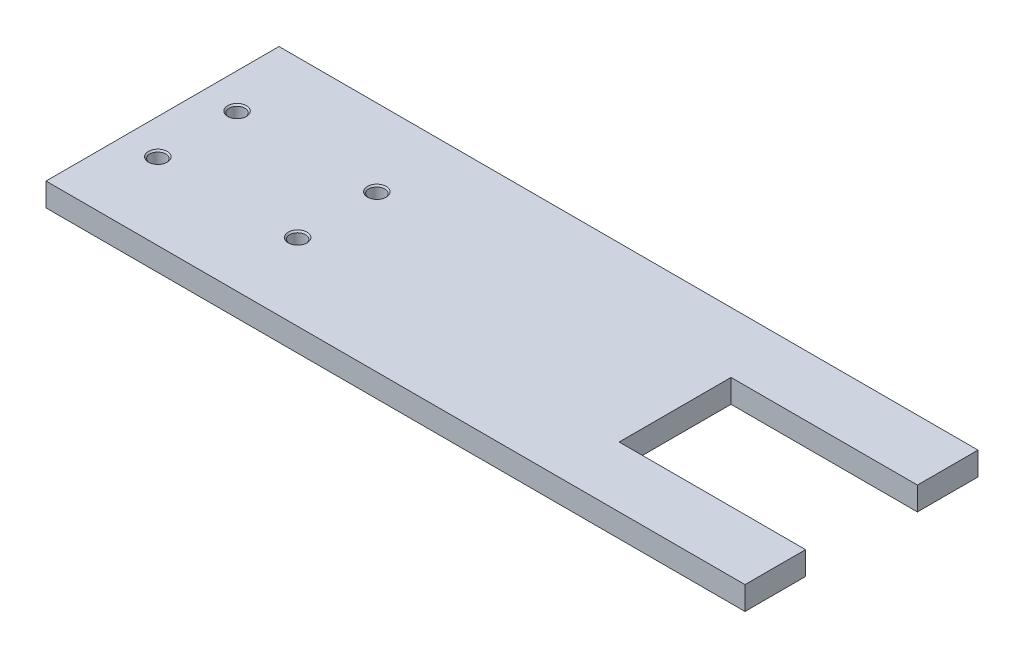
ISO-10303-21;
HEADER;
FILE_DESCRIPTION(('STEP AP214'),'2;1');
FILE_NAME('part.step','',(''),(''),'','','');
FILE_SCHEMA(('AUTOMOTIVE_DESIGN { 1 0 10303 214 1 1 1 1 }'));
ENDSEC;
DATA;
#1=APPLICATION_CONTEXT('core data for automotive mechanical design processes');
#2=APPLICATION_PROTOCOL_DEFINITION('international standard','automotive_design',2000,#1);
#3=PRODUCT_CONTEXT('',#1,'mechanical');
#4=PRODUCT('Part','Part','',(#3));
#5=PRODUCT_RELATED_PRODUCT_CATEGORY('part','',(#4));
#6=PRODUCT_DEFINITION_FORMATION('','',#4);
#7=PRODUCT_DEFINITION_CONTEXT('part definition',#1,'design');
#8=PRODUCT_DEFINITION('design','',#6,#7);
#9=PRODUCT_DEFINITION_SHAPE('','',#8);
#10=(LENGTH_UNIT() NAMED_UNIT(*) SI_UNIT(.MILLI.,.METRE.));
#11=(NAMED_UNIT(*) PLANE_ANGLE_UNIT() SI_UNIT($,.RADIAN.));
#12=(NAMED_UNIT(*) SI_UNIT($,.STERADIAN.) SOLID_ANGLE_UNIT());
#13=UNCERTAINTY_MEASURE_WITH_UNIT(LENGTH_MEASURE(1.E-05),#10,'distance_accuracy_value','');
#14=(GEOMETRIC_REPRESENTATION_CONTEXT(3) GLOBAL_UNCERTAINTY_ASSIGNED_CONTEXT((#13)) GLOBAL_UNIT_ASSIGNED_CONTEXT((#10,
#11,#12)) REPRESENTATION_CONTEXT('',''));
#15=CARTESIAN_POINT('',(0.,0.,0.));
#16=DIRECTION('',(0.,0.,1.));
#17=DIRECTION('',(1.,0.,0.));
#18=AXIS2_PLACEMENT_3D('',#15,#16,#17);
#19=CARTESIAN_POINT('',(-150.,5.,50.));
#20=DIRECTION('',(1.,0.,0.));
#21=DIRECTION('',(0.,0.,-1.));
#22=AXIS2_PLACEMENT_3D('',#19,#20,#21);
#23=PLANE('',#22);
#24=DIRECTION('',(0.,0.,1.));
#25=VECTOR('',#24,1.);
#26=CARTESIAN_POINT('',(-150.,-5.,50.));
#27=LINE('',#26,#25);
#28=CARTESIAN_POINT('',(-150.,-5.,-50.));
#29=VERTEX_POINT('',#28);
#30=CARTESIAN_POINT('',(-150.,-5.,50.));
#31=VERTEX_POINT('',#30);
#32=EDGE_CURVE('E136',#29,#31,#27,.T.);
#33=ORIENTED_EDGE('',*,*,#32,.T.);
#34=DIRECTION('',(0.,-1.,0.));
#35=VECTOR('',#34,1.);
#36=CARTESIAN_POINT('',(-150.,5.,50.));
#37=LINE('',#36,#35);
#38=CARTESIAN_POINT('',(-150.,5.,50.));
#39=VERTEX_POINT('',#38);
#40=EDGE_CURVE('E11',#39,#31,#37,.T.);
#41=ORIENTED_EDGE('',*,*,#40,.F.);
#42=DIRECTION('',(0.,0.,1.));
#43=VECTOR('',#42,1.);
#44=CARTESIAN_POINT('',(-150.,5.,50.));
#45=LINE('',#44,#43);
#46=CARTESIAN_POINT('',(-150.,5.,-50.));
#47=VERTEX_POINT('',#46);
#48=EDGE_CURVE('E151',#47,#39,#45,.T.);
#49=ORIENTED_EDGE('',*,*,#48,.F.);
#50=DIRECTION('',(0.,-1.,0.));
#51=VECTOR('',#50,1.);
#52=CARTESIAN_POINT('',(-150.,5.,-50.));
#53=LINE('',#52,#51);
#54=EDGE_CURVE('E132',#47,#29,#53,.T.);
#55=ORIENTED_EDGE('',*,*,#54,.T.);
#56=EDGE_LOOP('',(#33,#41,#49,#55));
#57=FACE_BOUND('',#56,.T.);
#58=ADVANCED_FACE('F40',(#57),#23,.F.);
#59=CARTESIAN_POINT('',(150.,5.,50.));
#60=DIRECTION('',(0.,0.,-1.));
#61=DIRECTION('',(-1.,0.,0.));
#62=AXIS2_PLACEMENT_3D('',#59,#60,#61);
#63=PLANE('',#62);
#64=DIRECTION('',(1.,0.,0.));
#65=VECTOR('',#64,1.);
#66=CARTESIAN_POINT('',(150.,-5.,50.));
#67=LINE('',#66,#65);
#68=CARTESIAN_POINT('',(150.,-5.,50.));
#69=VERTEX_POINT('',#68);
#70=EDGE_CURVE('E139',#31,#69,#67,.T.);
#71=ORIENTED_EDGE('',*,*,#70,.T.);
#72=DIRECTION('',(0.,-1.,0.));
#73=VECTOR('',#72,1.);
#74=CARTESIAN_POINT('',(150.,5.,50.));
#75=LINE('',#74,#73);
#76=CARTESIAN_POINT('',(150.,5.,50.));
#77=VERTEX_POINT('',#76);
#78=EDGE_CURVE('E48',#77,#69,#75,.T.);
#79=ORIENTED_EDGE('',*,*,#78,.F.);
#80=DIRECTION('',(1.,0.,0.));
#81=VECTOR('',#80,1.);
#82=CARTESIAN_POINT('',(150.,5.,50.));
#83=LINE('',#82,#81);
#84=EDGE_CURVE('E99',#39,#77,#83,.T.);
#85=ORIENTED_EDGE('',*,*,#84,.F.);
#86=ORIENTED_EDGE('',*,*,#40,.T.);
#87=EDGE_LOOP('',(#71,#79,#85,#86));
#88=FACE_BOUND('',#87,.T.);
#89=ADVANCED_FACE('F249',(#88),#63,.F.);
#90=CARTESIAN_POINT('',(150.,5.,50.));
#91=DIRECTION('',(-1.,0.,0.));
#92=DIRECTION('',(0.,0.,1.));
#93=AXIS2_PLACEMENT_3D('',#90,#91,#92);
#94=PLANE('',#93);
#95=DIRECTION('',(0.,0.,-1.));
#96=VECTOR('',#95,1.);
#97=CARTESIAN_POINT('',(150.,-5.,50.));
#98=LINE('',#97,#96);
#99=CARTESIAN_POINT('',(150.,-5.,24.));
#100=VERTEX_POINT('',#99);
#101=EDGE_CURVE('E142',#69,#100,#98,.T.);
#102=ORIENTED_EDGE('',*,*,#101,.T.);
#103=DIRECTION('',(0.,-1.,0.));
#104=VECTOR('',#103,1.);
#105=CARTESIAN_POINT('',(150.,5.,24.));
#106=LINE('',#105,#104);
#107=CARTESIAN_POINT('',(150.,5.,24.));
#108=VERTEX_POINT('',#107);
#109=EDGE_CURVE('E158',#108,#100,#106,.T.);
#110=ORIENTED_EDGE('',*,*,#109,.F.);
#111=DIRECTION('',(0.,0.,-1.));
#112=VECTOR('',#111,1.);
#113=CARTESIAN_POINT('',(150.,5.,50.));
#114=LINE('',#113,#112);
#115=EDGE_CURVE('E166',#77,#108,#114,.T.);
#116=ORIENTED_EDGE('',*,*,#115,.F.);
#117=ORIENTED_EDGE('',*,*,#78,.T.);
#118=EDGE_LOOP('',(#102,#110,#116,#117));
#119=FACE_BOUND('',#118,.T.);
#120=ADVANCED_FACE('F164',(#119),#94,.F.);
#121=CARTESIAN_POINT('',(70.,5.,24.));
#122=DIRECTION('',(0.,0.,1.));
#123=DIRECTION('',(1.,0.,0.));
#124=AXIS2_PLACEMENT_3D('',#121,#122,#123);
#125=PLANE('',#124);
#126=DIRECTION('',(-1.,0.,0.));
#127=VECTOR('',#126,1.);
#128=CARTESIAN_POINT('',(70.,-5.,24.));
#129=LINE('',#128,#127);
#130=CARTESIAN_POINT('',(70.,-5.,24.));
#131=VERTEX_POINT('',#130);
#132=EDGE_CURVE('E144',#100,#131,#129,.T.);
#133=ORIENTED_EDGE('',*,*,#132,.T.);
#134=DIRECTION('',(0.,-1.,0.));
#135=VECTOR('',#134,1.);
#136=CARTESIAN_POINT('',(70.,5.,24.));
#137=LINE('',#136,#135);
#138=CARTESIAN_POINT('',(70.,5.,24.));
#139=VERTEX_POINT('',#138);
#140=EDGE_CURVE('E155',#139,#131,#137,.T.);
#141=ORIENTED_EDGE('',*,*,#140,.F.);
#142=DIRECTION('',(-1.,0.,0.));
#143=VECTOR('',#142,1.);
#144=CARTESIAN_POINT('',(70.,5.,24.));
#145=LINE('',#144,#143);
#146=EDGE_CURVE('E178',#108,#139,#145,.T.);
#147=ORIENTED_EDGE('',*,*,#146,.F.);
#148=ORIENTED_EDGE('',*,*,#109,.T.);
#149=EDGE_LOOP('',(#133,#141,#147,#148));
#150=FACE_BOUND('',#149,.T.);
#151=ADVANCED_FACE('F174',(#150),#125,.F.);
#152=CARTESIAN_POINT('',(70.,5.,-24.));
#153=DIRECTION('',(-1.,0.,0.));
#154=DIRECTION('',(0.,0.,1.));
#155=AXIS2_PLACEMENT_3D('',#152,#153,#154);
#156=PLANE('',#155);
#157=DIRECTION('',(0.,0.,-1.));
#158=VECTOR('',#157,1.);
#159=CARTESIAN_POINT('',(70.,-5.,-24.));
#160=LINE('',#159,#158);
#161=CARTESIAN_POINT('',(70.,-5.,-24.));
#162=VERTEX_POINT('',#161);
#163=EDGE_CURVE('E146',#131,#162,#160,.T.);
#164=ORIENTED_EDGE('',*,*,#163,.T.);
#165=DIRECTION('',(0.,-1.,0.));
#166=VECTOR('',#165,1.);
#167=CARTESIAN_POINT('',(70.,5.,-24.));
#168=LINE('',#167,#166);
#169=CARTESIAN_POINT('',(70.,5.,-24.));
#170=VERTEX_POINT('',#169);
#171=EDGE_CURVE('E127',#170,#162,#168,.T.);
#172=ORIENTED_EDGE('',*,*,#171,.F.);
#173=DIRECTION('',(0.,0.,-1.));
#174=VECTOR('',#173,1.);
#175=CARTESIAN_POINT('',(70.,5.,-24.));
#176=LINE('',#175,#174);
#177=EDGE_CURVE('E118',#139,#170,#176,.T.);
#178=ORIENTED_EDGE('',*,*,#177,.F.);
#179=ORIENTED_EDGE('',*,*,#140,.T.);
#180=EDGE_LOOP('',(#164,#172,#178,#179));
#181=FACE_BOUND('',#180,.T.);
#182=ADVANCED_FACE('F177',(#181),#156,.F.);
#183=CARTESIAN_POINT('',(70.,5.,-24.));
#184=DIRECTION('',(0.,0.,-1.));
#185=DIRECTION('',(-1.,0.,0.));
#186=AXIS2_PLACEMENT_3D('',#183,#184,#185);
#187=PLANE('',#186);
#188=DIRECTION('',(1.,0.,0.));
#189=VECTOR('',#188,1.);
#190=CARTESIAN_POINT('',(70.,-5.,-24.));
#191=LINE('',#190,#189);
#192=CARTESIAN_POINT('',(150.,-5.,-24.));
#193=VERTEX_POINT('',#192);
#194=EDGE_CURVE('E126',#162,#193,#191,.T.);
#195=ORIENTED_EDGE('',*,*,#194,.T.);
#196=DIRECTION('',(0.,-1.,0.));
#197=VECTOR('',#196,1.);
#198=CARTESIAN_POINT('',(150.,5.,-24.));
#199=LINE('',#198,#197);
#200=CARTESIAN_POINT('',(150.,5.,-24.));
#201=VERTEX_POINT('',#200);
#202=EDGE_CURVE('E123',#201,#193,#199,.T.);
#203=ORIENTED_EDGE('',*,*,#202,.F.);
#204=DIRECTION('',(1.,0.,0.));
#205=VECTOR('',#204,1.);
#206=CARTESIAN_POINT('',(70.,5.,-24.));
#207=LINE('',#206,#205);
#208=EDGE_CURVE('E112',#170,#201,#207,.T.);
#209=ORIENTED_EDGE('',*,*,#208,.F.);
#210=ORIENTED_EDGE('',*,*,#171,.T.);
#211=EDGE_LOOP('',(#195,#203,#209,#210));
#212=FACE_BOUND('',#211,.T.);
#213=ADVANCED_FACE('F124',(#212),#187,.F.);
#214=CARTESIAN_POINT('',(150.,5.,-24.));
#215=DIRECTION('',(-1.,0.,0.));
#216=DIRECTION('',(0.,0.,1.));
#217=AXIS2_PLACEMENT_3D('',#214,#215,#216);
#218=PLANE('',#217);
#219=DIRECTION('',(0.,0.,-1.));
#220=VECTOR('',#219,1.);
#221=CARTESIAN_POINT('',(150.,-5.,-24.));
#222=LINE('',#221,#220);
#223=CARTESIAN_POINT('',(150.,-5.,-50.));
#224=VERTEX_POINT('',#223);
#225=EDGE_CURVE('E85',#193,#224,#222,.T.);
#226=ORIENTED_EDGE('',*,*,#225,.T.);
#227=DIRECTION('',(0.,-1.,0.));
#228=VECTOR('',#227,1.);
#229=CARTESIAN_POINT('',(150.,5.,-50.));
#230=LINE('',#229,#228);
#231=CARTESIAN_POINT('',(150.,5.,-50.));
#232=VERTEX_POINT('',#231);
#233=EDGE_CURVE('E128',#232,#224,#230,.T.);
#234=ORIENTED_EDGE('',*,*,#233,.F.);
#235=DIRECTION('',(0.,0.,-1.));
#236=VECTOR('',#235,1.);
#237=CARTESIAN_POINT('',(150.,5.,-24.));
#238=LINE('',#237,#236);
#239=EDGE_CURVE('E116',#201,#232,#238,.T.);
#240=ORIENTED_EDGE('',*,*,#239,.F.);
#241=ORIENTED_EDGE('',*,*,#202,.T.);
#242=EDGE_LOOP('',(#226,#234,#240,#241));
#243=FACE_BOUND('',#242,.T.);
#244=ADVANCED_FACE('F130',(#243),#218,.F.);
#245=CARTESIAN_POINT('',(150.,5.,-50.));
#246=DIRECTION('',(0.,0.,1.));
#247=DIRECTION('',(1.,0.,0.));
#248=AXIS2_PLACEMENT_3D('',#245,#246,#247);
#249=PLANE('',#248);
#250=DIRECTION('',(-1.,0.,0.));
#251=VECTOR('',#250,1.);
#252=CARTESIAN_POINT('',(150.,-5.,-50.));
#253=LINE('',#252,#251);
#254=EDGE_CURVE('E91',#224,#29,#253,.T.);
#255=ORIENTED_EDGE('',*,*,#254,.T.);
#256=ORIENTED_EDGE('',*,*,#54,.F.);
#257=DIRECTION('',(-1.,0.,0.));
#258=VECTOR('',#257,1.);
#259=CARTESIAN_POINT('',(150.,5.,-50.));
#260=LINE('',#259,#258);
#261=EDGE_CURVE('E56',#232,#47,#260,.T.);
#262=ORIENTED_EDGE('',*,*,#261,.F.);
#263=ORIENTED_EDGE('',*,*,#233,.T.);
#264=EDGE_LOOP('',(#255,#256,#262,#263));
#265=FACE_BOUND('',#264,.T.);
#266=ADVANCED_FACE('F224',(#265),#249,.F.);
#267=CARTESIAN_POINT('',(0.,5.,0.));
#268=DIRECTION('',(0.,1.,0.));
#269=DIRECTION('',(0.,0.,1.));
#270=AXIS2_PLACEMENT_3D('',#267,#268,#269);
#271=PLANE('',#270);
#272=CARTESIAN_POINT('',(-135.,5.,-17.));
#273=DIRECTION('',(0.,1.,0.));
#274=DIRECTION('',(0.,0.,1.));
#275=AXIS2_PLACEMENT_3D('',#272,#273,#274);
#276=CIRCLE('',#275,4.025);
#277=CARTESIAN_POINT('',(-135.,5.,-12.975));
#278=VERTEX_POINT('',#277);
#279=EDGE_CURVE('E216',#278,#278,#276,.T.);
#280=ORIENTED_EDGE('',*,*,#279,.F.);
#281=EDGE_LOOP('',(#280));
#282=FACE_BOUND('',#281,.T.);
#283=CARTESIAN_POINT('',(-135.,5.,17.));
#284=DIRECTION('',(0.,1.,0.));
#285=DIRECTION('',(0.,0.,1.));
#286=AXIS2_PLACEMENT_3D('',#283,#284,#285);
#287=CIRCLE('',#286,4.025);
#288=CARTESIAN_POINT('',(-135.,5.,21.025));
#289=VERTEX_POINT('',#288);
#290=EDGE_CURVE('E207',#289,#289,#287,.T.);
#291=ORIENTED_EDGE('',*,*,#290,.F.);
#292=EDGE_LOOP('',(#291));
#293=FACE_BOUND('',#292,.T.);
#294=CARTESIAN_POINT('',(-75.,5.,17.));
#295=DIRECTION('',(0.,1.,0.));
#296=DIRECTION('',(0.,0.,1.));
#297=AXIS2_PLACEMENT_3D('',#294,#295,#296);
#298=CIRCLE('',#297,4.025);
#299=CARTESIAN_POINT('',(-75.,5.,21.025));
#300=VERTEX_POINT('',#299);
#301=EDGE_CURVE('E198',#300,#300,#298,.T.);
#302=ORIENTED_EDGE('',*,*,#301,.F.);
#303=EDGE_LOOP('',(#302));
#304=FACE_BOUND('',#303,.T.);
#305=CARTESIAN_POINT('',(-75.,5.,-17.));
#306=DIRECTION('',(0.,1.,0.));
#307=DIRECTION('',(0.,0.,1.));
#308=AXIS2_PLACEMENT_3D('',#305,#306,#307);
#309=CIRCLE('',#308,4.025);
#310=CARTESIAN_POINT('',(-75.,5.,-12.975));
#311=VERTEX_POINT('',#310);
#312=EDGE_CURVE('E189',#311,#311,#309,.T.);
#313=ORIENTED_EDGE('',*,*,#312,.F.);
#314=EDGE_LOOP('',(#313));
#315=FACE_BOUND('',#314,.T.);
#316=ORIENTED_EDGE('',*,*,#48,.T.);
#317=ORIENTED_EDGE('',*,*,#84,.T.);
#318=ORIENTED_EDGE('',*,*,#115,.T.);
#319=ORIENTED_EDGE('',*,*,#146,.T.);
#320=ORIENTED_EDGE('',*,*,#177,.T.);
#321=ORIENTED_EDGE('',*,*,#208,.T.);
#322=ORIENTED_EDGE('',*,*,#239,.T.);
#323=ORIENTED_EDGE('',*,*,#261,.T.);
#324=EDGE_LOOP('',(#316,#317,#318,#319,#320,#321,#322,#323));
#325=FACE_BOUND('',#324,.T.);
#326=ADVANCED_FACE('F114',(#282,#293,#304,#315,#325),#271,.T.);
#327=CARTESIAN_POINT('',(0.,-5.,0.));
#328=DIRECTION('',(0.,1.,0.));
#329=DIRECTION('',(0.,0.,1.));
#330=AXIS2_PLACEMENT_3D('',#327,#328,#329);
#331=PLANE('',#330);
#332=CARTESIAN_POINT('',(-135.,-5.,-17.));
#333=DIRECTION('',(0.,1.,0.));
#334=DIRECTION('',(0.,0.,1.));
#335=AXIS2_PLACEMENT_3D('',#332,#333,#334);
#336=CIRCLE('',#335,3.39999999999999);
#337=CARTESIAN_POINT('',(-135.,-5.,-13.6));
#338=VERTEX_POINT('',#337);
#339=EDGE_CURVE('E210',#338,#338,#336,.T.);
#340=ORIENTED_EDGE('',*,*,#339,.T.);
#341=EDGE_LOOP('',(#340));
#342=FACE_BOUND('',#341,.T.);
#343=CARTESIAN_POINT('',(-135.,-5.,17.));
#344=DIRECTION('',(0.,1.,0.));
#345=DIRECTION('',(0.,0.,1.));
#346=AXIS2_PLACEMENT_3D('',#343,#344,#345);
#347=CIRCLE('',#346,3.39999999999999);
#348=CARTESIAN_POINT('',(-135.,-5.,20.4));
#349=VERTEX_POINT('',#348);
#350=EDGE_CURVE('E201',#349,#349,#347,.T.);
#351=ORIENTED_EDGE('',*,*,#350,.T.);
#352=EDGE_LOOP('',(#351));
#353=FACE_BOUND('',#352,.T.);
#354=CARTESIAN_POINT('',(-75.,-5.,17.));
#355=DIRECTION('',(0.,1.,0.));
#356=DIRECTION('',(0.,0.,1.));
#357=AXIS2_PLACEMENT_3D('',#354,#355,#356);
#358=CIRCLE('',#357,3.4);
#359=CARTESIAN_POINT('',(-75.,-5.,20.4));
#360=VERTEX_POINT('',#359);
#361=EDGE_CURVE('E192',#360,#360,#358,.T.);
#362=ORIENTED_EDGE('',*,*,#361,.T.);
#363=EDGE_LOOP('',(#362));
#364=FACE_BOUND('',#363,.T.);
#365=CARTESIAN_POINT('',(-75.,-5.,-17.));
#366=DIRECTION('',(0.,1.,0.));
#367=DIRECTION('',(0.,0.,1.));
#368=AXIS2_PLACEMENT_3D('',#365,#366,#367);
#369=CIRCLE('',#368,3.4);
#370=CARTESIAN_POINT('',(-75.,-5.,-13.6));
#371=VERTEX_POINT('',#370);
#372=EDGE_CURVE('E140',#371,#371,#369,.T.);
#373=ORIENTED_EDGE('',*,*,#372,.T.);
#374=EDGE_LOOP('',(#373));
#375=FACE_BOUND('',#374,.T.);
#376=ORIENTED_EDGE('',*,*,#32,.F.);
#377=ORIENTED_EDGE('',*,*,#254,.F.);
#378=ORIENTED_EDGE('',*,*,#225,.F.);
#379=ORIENTED_EDGE('',*,*,#194,.F.);
#380=ORIENTED_EDGE('',*,*,#163,.F.);
#381=ORIENTED_EDGE('',*,*,#132,.F.);
#382=ORIENTED_EDGE('',*,*,#101,.F.);
#383=ORIENTED_EDGE('',*,*,#70,.F.);
#384=EDGE_LOOP('',(#376,#377,#378,#379,#380,#381,#382,#383));
#385=FACE_BOUND('',#384,.T.);
#386=ADVANCED_FACE('F170',(#342,#353,#364,#375,#385),#331,.F.);
#387=CARTESIAN_POINT('',(-75.,5.,-17.));
#388=DIRECTION('',(0.,1.,0.));
#389=DIRECTION('',(0.,0.,1.));
#390=AXIS2_PLACEMENT_3D('',#387,#388,#389);
#391=CYLINDRICAL_SURFACE('',#390,3.39999999999999);
#392=ORIENTED_EDGE('',*,*,#372,.F.);
#393=EDGE_LOOP('',(#392));
#394=FACE_BOUND('',#393,.T.);
#395=CARTESIAN_POINT('',(-75.,4.37499999999999,-17.));
#396=DIRECTION('',(0.,1.,0.));
#397=DIRECTION('',(0.,0.,1.));
#398=AXIS2_PLACEMENT_3D('',#395,#396,#397);
#399=CIRCLE('',#398,3.39999999999999);
#400=CARTESIAN_POINT('',(-75.,4.37499999999999,-13.6));
#401=VERTEX_POINT('',#400);
#402=EDGE_CURVE('E186',#401,#401,#399,.T.);
#403=ORIENTED_EDGE('',*,*,#402,.T.);
#404=EDGE_LOOP('',(#403));
#405=FACE_BOUND('',#404,.T.);
#406=ADVANCED_FACE('F235',(#394,#405),#391,.F.);
#407=CARTESIAN_POINT('',(-75.,5.,-17.));
#408=DIRECTION('',(0.,1.,0.));
#409=DIRECTION('',(0.,0.,1.));
#410=AXIS2_PLACEMENT_3D('',#407,#408,#409);
#411=CONICAL_SURFACE('',#410,4.025,0.785398163397447);
#412=ORIENTED_EDGE('',*,*,#402,.F.);
#413=EDGE_LOOP('',(#412));
#414=FACE_BOUND('',#413,.T.);
#415=ORIENTED_EDGE('',*,*,#312,.T.);
#416=EDGE_LOOP('',(#415));
#417=FACE_BOUND('',#416,.T.);
#418=ADVANCED_FACE('F232',(#414,#417),#411,.F.);
#419=CARTESIAN_POINT('',(-75.,5.,17.));
#420=DIRECTION('',(0.,1.,0.));
#421=DIRECTION('',(0.,0.,1.));
#422=AXIS2_PLACEMENT_3D('',#419,#420,#421);
#423=CYLINDRICAL_SURFACE('',#422,3.39999999999999);
#424=ORIENTED_EDGE('',*,*,#361,.F.);
#425=EDGE_LOOP('',(#424));
#426=FACE_BOUND('',#425,.T.);
#427=CARTESIAN_POINT('',(-75.,4.37499999999999,17.));
#428=DIRECTION('',(0.,1.,0.));
#429=DIRECTION('',(0.,0.,1.));
#430=AXIS2_PLACEMENT_3D('',#427,#428,#429);
#431=CIRCLE('',#430,3.39999999999999);
#432=CARTESIAN_POINT('',(-75.,4.37499999999999,20.4));
#433=VERTEX_POINT('',#432);
#434=EDGE_CURVE('E195',#433,#433,#431,.T.);
#435=ORIENTED_EDGE('',*,*,#434,.T.);
#436=EDGE_LOOP('',(#435));
#437=FACE_BOUND('',#436,.T.);
#438=ADVANCED_FACE('F234',(#426,#437),#423,.F.);
#439=CARTESIAN_POINT('',(-75.,5.,17.));
#440=DIRECTION('',(0.,1.,0.));
#441=DIRECTION('',(0.,0.,1.));
#442=AXIS2_PLACEMENT_3D('',#439,#440,#441);
#443=CONICAL_SURFACE('',#442,4.025,0.785398163397447);
#444=ORIENTED_EDGE('',*,*,#434,.F.);
#445=EDGE_LOOP('',(#444));
#446=FACE_BOUND('',#445,.T.);
#447=ORIENTED_EDGE('',*,*,#301,.T.);
#448=EDGE_LOOP('',(#447));
#449=FACE_BOUND('',#448,.T.);
#450=ADVANCED_FACE('F242',(#446,#449),#443,.F.);
#451=CARTESIAN_POINT('',(-135.,5.,17.));
#452=DIRECTION('',(0.,1.,0.));
#453=DIRECTION('',(0.,0.,1.));
#454=AXIS2_PLACEMENT_3D('',#451,#452,#453);
#455=CYLINDRICAL_SURFACE('',#454,3.39999999999999);
#456=ORIENTED_EDGE('',*,*,#350,.F.);
#457=EDGE_LOOP('',(#456));
#458=FACE_BOUND('',#457,.T.);
#459=CARTESIAN_POINT('',(-135.,4.37499999999999,17.));
#460=DIRECTION('',(0.,1.,0.));
#461=DIRECTION('',(0.,0.,1.));
#462=AXIS2_PLACEMENT_3D('',#459,#460,#461);
#463=CIRCLE('',#462,3.39999999999999);
#464=CARTESIAN_POINT('',(-135.,4.37499999999999,20.4));
#465=VERTEX_POINT('',#464);
#466=EDGE_CURVE('E204',#465,#465,#463,.T.);
#467=ORIENTED_EDGE('',*,*,#466,.T.);
#468=EDGE_LOOP('',(#467));
#469=FACE_BOUND('',#468,.T.);
#470=ADVANCED_FACE('F342',(#458,#469),#455,.F.);
#471=CARTESIAN_POINT('',(-135.,5.,17.));
#472=DIRECTION('',(0.,1.,0.));
#473=DIRECTION('',(0.,0.,1.));
#474=AXIS2_PLACEMENT_3D('',#471,#472,#473);
#475=CONICAL_SURFACE('',#474,4.025,0.785398163397447);
#476=ORIENTED_EDGE('',*,*,#466,.F.);
#477=EDGE_LOOP('',(#476));
#478=FACE_BOUND('',#477,.T.);
#479=ORIENTED_EDGE('',*,*,#290,.T.);
#480=EDGE_LOOP('',(#479));
#481=FACE_BOUND('',#480,.T.);
#482=ADVANCED_FACE('F353',(#478,#481),#475,.F.);
#483=CARTESIAN_POINT('',(-135.,5.,-17.));
#484=DIRECTION('',(0.,1.,0.));
#485=DIRECTION('',(0.,0.,1.));
#486=AXIS2_PLACEMENT_3D('',#483,#484,#485);
#487=CYLINDRICAL_SURFACE('',#486,3.39999999999999);
#488=ORIENTED_EDGE('',*,*,#339,.F.);
#489=EDGE_LOOP('',(#488));
#490=FACE_BOUND('',#489,.T.);
#491=CARTESIAN_POINT('',(-135.,4.37499999999999,-17.));
#492=DIRECTION('',(0.,1.,0.));
#493=DIRECTION('',(0.,0.,1.));
#494=AXIS2_PLACEMENT_3D('',#491,#492,#493);
#495=CIRCLE('',#494,3.39999999999999);
#496=CARTESIAN_POINT('',(-135.,4.37499999999999,-13.6));
#497=VERTEX_POINT('',#496);
#498=EDGE_CURVE('E213',#497,#497,#495,.T.);
#499=ORIENTED_EDGE('',*,*,#498,.T.);
#500=EDGE_LOOP('',(#499));
#501=FACE_BOUND('',#500,.T.);
#502=ADVANCED_FACE('F365',(#490,#501),#487,.F.);
#503=CARTESIAN_POINT('',(-135.,5.,-17.));
#504=DIRECTION('',(0.,1.,0.));
#505=DIRECTION('',(0.,0.,1.));
#506=AXIS2_PLACEMENT_3D('',#503,#504,#505);
#507=CONICAL_SURFACE('',#506,4.025,0.785398163397447);
#508=ORIENTED_EDGE('',*,*,#498,.F.);
#509=EDGE_LOOP('',(#508));
#510=FACE_BOUND('',#509,.T.);
#511=ORIENTED_EDGE('',*,*,#279,.T.);
#512=EDGE_LOOP('',(#511));
#513=FACE_BOUND('',#512,.T.);
#514=ADVANCED_FACE('F220',(#510,#513),#507,.F.);
#515=CLOSED_SHELL('',(#58,#89,#120,#151,#182,#213,#244,#266,#326,#386,#406,#418,#438,#450,#470,
#482,#502,#514));
#516=MANIFOLD_SOLID_BREP('B2',#515);
#517=ADVANCED_BREP_SHAPE_REPRESENTATION('',(#18,#516),#14);
#518=SHAPE_DEFINITION_REPRESENTATION(#9,#517);
ENDSEC;
END-ISO-10303-21;
